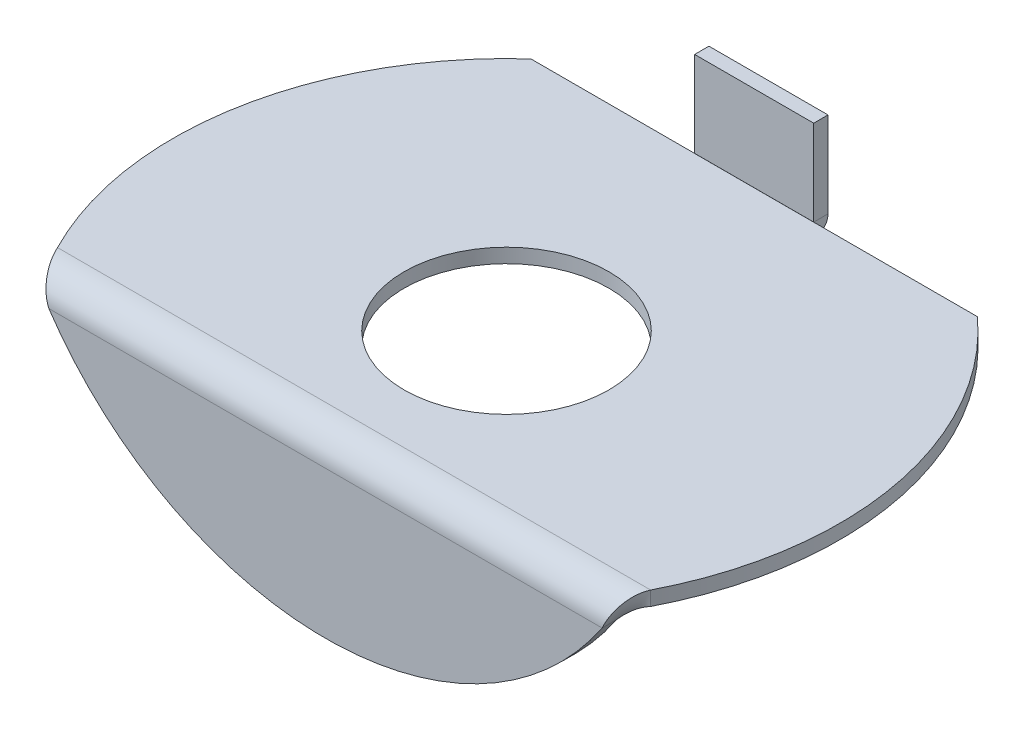
ISO-10303-21;
HEADER;
FILE_DESCRIPTION(('STEP AP214'),'2;1');
FILE_NAME('part.step','',(''),(''),'','','');
FILE_SCHEMA(('AUTOMOTIVE_DESIGN { 1 0 10303 214 1 1 1 1 }'));
ENDSEC;
DATA;
#1=APPLICATION_CONTEXT('core data for automotive mechanical design processes');
#2=APPLICATION_PROTOCOL_DEFINITION('international standard','automotive_design',2000,#1);
#3=PRODUCT_CONTEXT('',#1,'mechanical');
#4=PRODUCT('Part','Part','',(#3));
#5=PRODUCT_RELATED_PRODUCT_CATEGORY('part','',(#4));
#6=PRODUCT_DEFINITION_FORMATION('','',#4);
#7=PRODUCT_DEFINITION_CONTEXT('part definition',#1,'design');
#8=PRODUCT_DEFINITION('design','',#6,#7);
#9=PRODUCT_DEFINITION_SHAPE('','',#8);
#10=(LENGTH_UNIT() NAMED_UNIT(*) SI_UNIT(.MILLI.,.METRE.));
#11=(NAMED_UNIT(*) PLANE_ANGLE_UNIT() SI_UNIT($,.RADIAN.));
#12=(NAMED_UNIT(*) SI_UNIT($,.STERADIAN.) SOLID_ANGLE_UNIT());
#13=UNCERTAINTY_MEASURE_WITH_UNIT(LENGTH_MEASURE(1.E-05),#10,'distance_accuracy_value','');
#14=(GEOMETRIC_REPRESENTATION_CONTEXT(3) GLOBAL_UNCERTAINTY_ASSIGNED_CONTEXT((#13)) GLOBAL_UNIT_ASSIGNED_CONTEXT((#10,
#11,#12)) REPRESENTATION_CONTEXT('',''));
#15=CARTESIAN_POINT('',(0.,0.,0.));
#16=DIRECTION('',(0.,0.,1.));
#17=DIRECTION('',(1.,0.,0.));
#18=AXIS2_PLACEMENT_3D('',#15,#16,#17);
#19=CARTESIAN_POINT('',(0.,0.3,0.));
#20=DIRECTION('',(0.,-1.,0.));
#21=DIRECTION('',(0.,0.,-1.));
#22=AXIS2_PLACEMENT_3D('',#19,#20,#21);
#23=CYLINDRICAL_SURFACE('',#22,7.);
#24=CARTESIAN_POINT('',(0.,0.3,0.));
#25=DIRECTION('',(0.,1.,0.));
#26=DIRECTION('',(0.,0.,1.));
#27=AXIS2_PLACEMENT_3D('',#24,#25,#26);
#28=CIRCLE('',#27,7.);
#29=CARTESIAN_POINT('',(6.22575296650934,0.300000002239978,3.2));
#30=VERTEX_POINT('',#29);
#31=CARTESIAN_POINT('',(4.68614980554399,0.3,-5.2));
#32=VERTEX_POINT('',#31);
#33=EDGE_CURVE('E377',#30,#32,#28,.T.);
#34=ORIENTED_EDGE('',*,*,#33,.F.);
#35=CARTESIAN_POINT('',(6.22575296650934,2.23997762612699E-09,3.2));
#36=CARTESIAN_POINT('',(6.22575296650934,0.300000002239978,3.2));
#37=B_SPLINE_CURVE_WITH_KNOTS('',1,(#35,#36),.UNSPECIFIED.,.F.,.F.,(2,2),(0.,1.),.UNSPECIFIED.);
#38=CARTESIAN_POINT('',(6.22575296650935,0.,3.2));
#39=VERTEX_POINT('',#38);
#40=EDGE_CURVE('E12',#30,#39,#37,.F.);
#41=ORIENTED_EDGE('',*,*,#40,.T.);
#42=CARTESIAN_POINT('',(0.,0.,0.));
#43=DIRECTION('',(0.,1.,0.));
#44=DIRECTION('',(0.,0.,1.));
#45=AXIS2_PLACEMENT_3D('',#42,#43,#44);
#46=CIRCLE('',#45,7.);
#47=CARTESIAN_POINT('',(4.68614980554399,0.,-5.2));
#48=VERTEX_POINT('',#47);
#49=EDGE_CURVE('E360',#39,#48,#46,.T.);
#50=ORIENTED_EDGE('',*,*,#49,.T.);
#51=DIRECTION('',(0.,-1.,0.));
#52=VECTOR('',#51,1.);
#53=CARTESIAN_POINT('',(4.68614980554399,0.3,-5.2));
#54=LINE('',#53,#52);
#55=EDGE_CURVE('E386',#32,#48,#54,.T.);
#56=ORIENTED_EDGE('',*,*,#55,.F.);
#57=EDGE_LOOP('',(#34,#41,#50,#56));
#58=FACE_BOUND('',#57,.T.);
#59=ADVANCED_FACE('F61',(#58),#23,.T.);
#60=CARTESIAN_POINT('',(-4.68614980554399,0.,-5.2));
#61=VERTEX_POINT('',#60);
#62=CARTESIAN_POINT('',(-6.22575296650935,2.2399776803371E-09,3.2));
#63=VERTEX_POINT('',#62);
#64=EDGE_CURVE('E352',#61,#63,#46,.T.);
#65=ORIENTED_EDGE('',*,*,#64,.T.);
#66=CARTESIAN_POINT('',(-6.22575296650936,0.300000002239978,3.2));
#67=CARTESIAN_POINT('',(-6.22575296650936,2.23997762612699E-09,3.2));
#68=B_SPLINE_CURVE_WITH_KNOTS('',1,(#66,#67),.UNSPECIFIED.,.F.,.F.,(2,2),(0.,1.),.UNSPECIFIED.);
#69=CARTESIAN_POINT('',(-6.22575296650935,0.300000002239978,3.2));
#70=VERTEX_POINT('',#69);
#71=EDGE_CURVE('E383',#63,#70,#68,.F.);
#72=ORIENTED_EDGE('',*,*,#71,.T.);
#73=CARTESIAN_POINT('',(-4.68614980554399,0.3,-5.2));
#74=VERTEX_POINT('',#73);
#75=EDGE_CURVE('E382',#74,#70,#28,.T.);
#76=ORIENTED_EDGE('',*,*,#75,.F.);
#77=DIRECTION('',(0.,-1.,0.));
#78=VECTOR('',#77,1.);
#79=CARTESIAN_POINT('',(-4.68614980554399,0.3,-5.2));
#80=LINE('',#79,#78);
#81=EDGE_CURVE('E397',#74,#61,#80,.T.);
#82=ORIENTED_EDGE('',*,*,#81,.T.);
#83=EDGE_LOOP('',(#65,#72,#76,#82));
#84=FACE_BOUND('',#83,.T.);
#85=ADVANCED_FACE('F327',(#84),#23,.T.);
#86=CARTESIAN_POINT('',(0.,0.,0.));
#87=DIRECTION('',(0.,1.,0.));
#88=DIRECTION('',(0.,0.,1.));
#89=AXIS2_PLACEMENT_3D('',#86,#87,#88);
#90=PLANE('',#89);
#91=CARTESIAN_POINT('',(0.,0.,0.));
#92=DIRECTION('',(0.,-1.,0.));
#93=DIRECTION('',(0.,0.,-1.));
#94=AXIS2_PLACEMENT_3D('',#91,#92,#93);
#95=CIRCLE('',#94,2.15);
#96=CARTESIAN_POINT('',(0.,0.,-2.15));
#97=VERTEX_POINT('',#96);
#98=EDGE_CURVE('E291',#97,#97,#95,.T.);
#99=ORIENTED_EDGE('',*,*,#98,.F.);
#100=EDGE_LOOP('',(#99));
#101=FACE_BOUND('',#100,.T.);
#102=ORIENTED_EDGE('',*,*,#49,.F.);
#103=DIRECTION('',(-1.,0.,0.));
#104=VECTOR('',#103,1.);
#105=CARTESIAN_POINT('',(0.,0.,3.2));
#106=LINE('',#105,#104);
#107=EDGE_CURVE('E72',#39,#63,#106,.T.);
#108=ORIENTED_EDGE('',*,*,#107,.T.);
#109=ORIENTED_EDGE('',*,*,#64,.F.);
#110=DIRECTION('',(-1.,0.,0.));
#111=VECTOR('',#110,1.);
#112=CARTESIAN_POINT('',(-4.68614980554399,0.,-5.2));
#113=LINE('',#112,#111);
#114=CARTESIAN_POINT('',(-1.25,0.,-5.2));
#115=VERTEX_POINT('',#114);
#116=EDGE_CURVE('E359',#115,#61,#113,.T.);
#117=ORIENTED_EDGE('',*,*,#116,.F.);
#118=DIRECTION('',(-2.16840434497072E-13,0.,-1.));
#119=VECTOR('',#118,1.);
#120=CARTESIAN_POINT('',(-1.24999999999887,0.,2.71050543121096E-13));
#121=LINE('',#120,#119);
#122=CARTESIAN_POINT('',(-1.25,0.,-5.199));
#123=VERTEX_POINT('',#122);
#124=EDGE_CURVE('E384',#123,#115,#121,.T.);
#125=ORIENTED_EDGE('',*,*,#124,.F.);
#126=DIRECTION('',(-1.,0.,0.));
#127=VECTOR('',#126,1.);
#128=CARTESIAN_POINT('',(-1.25,0.,-5.199));
#129=LINE('',#128,#127);
#130=CARTESIAN_POINT('',(1.25,0.,-5.199));
#131=VERTEX_POINT('',#130);
#132=EDGE_CURVE('E433',#123,#131,#129,.F.);
#133=ORIENTED_EDGE('',*,*,#132,.T.);
#134=CARTESIAN_POINT('',(1.25,0.301,-5.199));
#135=DIRECTION('',(-1.,0.,0.));
#136=DIRECTION('',(0.,0.,1.));
#137=AXIS2_PLACEMENT_3D('',#134,#135,#136);
#138=CIRCLE('',#137,0.301);
#139=CARTESIAN_POINT('',(1.25,0.,-5.2));
#140=VERTEX_POINT('',#139);
#141=EDGE_CURVE('E429',#131,#140,#138,.F.);
#142=ORIENTED_EDGE('',*,*,#141,.T.);
#143=EDGE_CURVE('E391',#48,#140,#113,.T.);
#144=ORIENTED_EDGE('',*,*,#143,.F.);
#145=EDGE_LOOP('',(#102,#108,#109,#117,#125,#133,#142,#144));
#146=FACE_BOUND('',#145,.T.);
#147=ADVANCED_FACE('F63',(#101,#146),#90,.F.);
#148=CARTESIAN_POINT('',(-4.68614980554399,0.3,-5.2));
#149=DIRECTION('',(0.,0.,1.));
#150=DIRECTION('',(1.,0.,0.));
#151=AXIS2_PLACEMENT_3D('',#148,#149,#150);
#152=PLANE('',#151);
#153=DIRECTION('',(0.,-1.,0.));
#154=VECTOR('',#153,1.);
#155=CARTESIAN_POINT('',(-1.25,0.3,-5.2));
#156=LINE('',#155,#154);
#157=CARTESIAN_POINT('',(-1.25,0.3,-5.2));
#158=VERTEX_POINT('',#157);
#159=EDGE_CURVE('E405',#158,#115,#156,.T.);
#160=ORIENTED_EDGE('',*,*,#159,.T.);
#161=ORIENTED_EDGE('',*,*,#116,.T.);
#162=ORIENTED_EDGE('',*,*,#81,.F.);
#163=DIRECTION('',(-1.,0.,0.));
#164=VECTOR('',#163,1.);
#165=CARTESIAN_POINT('',(-4.68614980554399,0.3,-5.2));
#166=LINE('',#165,#164);
#167=EDGE_CURVE('E392',#158,#74,#166,.T.);
#168=ORIENTED_EDGE('',*,*,#167,.F.);
#169=EDGE_LOOP('',(#160,#161,#162,#168));
#170=FACE_BOUND('',#169,.T.);
#171=ADVANCED_FACE('F497',(#170),#152,.F.);
#172=DIRECTION('',(0.,-1.,0.));
#173=VECTOR('',#172,1.);
#174=CARTESIAN_POINT('',(1.25,0.3,-5.2));
#175=LINE('',#174,#173);
#176=CARTESIAN_POINT('',(1.25,0.3,-5.2));
#177=VERTEX_POINT('',#176);
#178=EDGE_CURVE('E365',#177,#140,#175,.T.);
#179=ORIENTED_EDGE('',*,*,#178,.F.);
#180=EDGE_CURVE('E393',#32,#177,#166,.T.);
#181=ORIENTED_EDGE('',*,*,#180,.F.);
#182=ORIENTED_EDGE('',*,*,#55,.T.);
#183=ORIENTED_EDGE('',*,*,#143,.T.);
#184=EDGE_LOOP('',(#179,#181,#182,#183));
#185=FACE_BOUND('',#184,.T.);
#186=ADVANCED_FACE('F415',(#185),#152,.F.);
#187=CARTESIAN_POINT('',(0.,0.3,0.));
#188=DIRECTION('',(0.,1.,0.));
#189=DIRECTION('',(0.,0.,1.));
#190=AXIS2_PLACEMENT_3D('',#187,#188,#189);
#191=PLANE('',#190);
#192=CARTESIAN_POINT('',(0.,0.3,0.));
#193=DIRECTION('',(0.,1.,0.));
#194=DIRECTION('',(0.,0.,1.));
#195=AXIS2_PLACEMENT_3D('',#192,#193,#194);
#196=CIRCLE('',#195,2.15);
#197=CARTESIAN_POINT('',(0.,0.3,2.15));
#198=VERTEX_POINT('',#197);
#199=EDGE_CURVE('E505',#198,#198,#196,.F.);
#200=ORIENTED_EDGE('',*,*,#199,.T.);
#201=EDGE_LOOP('',(#200));
#202=FACE_BOUND('',#201,.T.);
#203=DIRECTION('',(-1.,0.,0.));
#204=VECTOR('',#203,1.);
#205=CARTESIAN_POINT('',(0.,0.3,3.2));
#206=LINE('',#205,#204);
#207=EDGE_CURVE('E203',#30,#70,#206,.T.);
#208=ORIENTED_EDGE('',*,*,#207,.F.);
#209=ORIENTED_EDGE('',*,*,#33,.T.);
#210=ORIENTED_EDGE('',*,*,#180,.T.);
#211=DIRECTION('',(0.,2.7105054312134E-13,-1.));
#212=VECTOR('',#211,1.);
#213=CARTESIAN_POINT('',(1.25,0.3,-5.199));
#214=LINE('',#213,#212);
#215=CARTESIAN_POINT('',(1.25,0.3,-5.199));
#216=VERTEX_POINT('',#215);
#217=EDGE_CURVE('E424',#216,#177,#214,.T.);
#218=ORIENTED_EDGE('',*,*,#217,.F.);
#219=DIRECTION('',(-1.,0.,0.));
#220=VECTOR('',#219,1.);
#221=CARTESIAN_POINT('',(-1.25,0.3,-5.199));
#222=LINE('',#221,#220);
#223=CARTESIAN_POINT('',(-1.25,0.3,-5.199));
#224=VERTEX_POINT('',#223);
#225=EDGE_CURVE('E88',#224,#216,#222,.F.);
#226=ORIENTED_EDGE('',*,*,#225,.F.);
#227=DIRECTION('',(2.16840434497072E-13,-2.7105054312134E-13,1.));
#228=VECTOR('',#227,1.);
#229=CARTESIAN_POINT('',(-1.25,0.3,-5.2));
#230=LINE('',#229,#228);
#231=EDGE_CURVE('E373',#158,#224,#230,.T.);
#232=ORIENTED_EDGE('',*,*,#231,.F.);
#233=ORIENTED_EDGE('',*,*,#167,.T.);
#234=ORIENTED_EDGE('',*,*,#75,.T.);
#235=EDGE_LOOP('',(#208,#209,#210,#218,#226,#232,#233,#234));
#236=FACE_BOUND('',#235,.T.);
#237=ADVANCED_FACE('F337',(#202,#236),#191,.T.);
#238=CARTESIAN_POINT('',(-1.25,0.301,-5.199));
#239=DIRECTION('',(1.,0.,0.));
#240=DIRECTION('',(0.,0.,-1.));
#241=AXIS2_PLACEMENT_3D('',#238,#239,#240);
#242=PLANE('',#241);
#243=ORIENTED_EDGE('',*,*,#159,.F.);
#244=ORIENTED_EDGE('',*,*,#231,.T.);
#245=CARTESIAN_POINT('',(-1.25,0.301,-5.199));
#246=DIRECTION('',(-1.,0.,0.));
#247=DIRECTION('',(0.,0.,1.));
#248=AXIS2_PLACEMENT_3D('',#245,#246,#247);
#249=CIRCLE('',#248,0.00100000000000013);
#250=CARTESIAN_POINT('',(-1.25,0.301,-5.2));
#251=VERTEX_POINT('',#250);
#252=EDGE_CURVE('E445',#251,#224,#249,.T.);
#253=ORIENTED_EDGE('',*,*,#252,.F.);
#254=DIRECTION('',(0.,0.,-1.));
#255=VECTOR('',#254,1.);
#256=CARTESIAN_POINT('',(-1.25,0.301,-5.2));
#257=LINE('',#256,#255);
#258=CARTESIAN_POINT('',(-1.25,0.301000000000002,-5.5));
#259=VERTEX_POINT('',#258);
#260=EDGE_CURVE('E473',#251,#259,#257,.T.);
#261=ORIENTED_EDGE('',*,*,#260,.T.);
#262=CARTESIAN_POINT('',(-1.25,0.301,-5.199));
#263=DIRECTION('',(-1.,0.,0.));
#264=DIRECTION('',(0.,0.,1.));
#265=AXIS2_PLACEMENT_3D('',#262,#263,#264);
#266=CIRCLE('',#265,0.301);
#267=EDGE_CURVE('E436',#259,#115,#266,.T.);
#268=ORIENTED_EDGE('',*,*,#267,.T.);
#269=EDGE_LOOP('',(#243,#244,#253,#261,#268));
#270=FACE_BOUND('',#269,.T.);
#271=ADVANCED_FACE('F517',(#270),#242,.F.);
#272=CARTESIAN_POINT('',(1.25,0.301,-5.199));
#273=DIRECTION('',(1.,0.,0.));
#274=DIRECTION('',(0.,0.,-1.));
#275=AXIS2_PLACEMENT_3D('',#272,#273,#274);
#276=PLANE('',#275);
#277=ORIENTED_EDGE('',*,*,#217,.T.);
#278=ORIENTED_EDGE('',*,*,#178,.T.);
#279=CARTESIAN_POINT('',(1.25,0.301,-5.5));
#280=VERTEX_POINT('',#279);
#281=EDGE_CURVE('E421',#140,#280,#138,.F.);
#282=ORIENTED_EDGE('',*,*,#281,.T.);
#283=DIRECTION('',(0.,0.,-1.));
#284=VECTOR('',#283,1.);
#285=CARTESIAN_POINT('',(1.25,0.301,-5.2));
#286=LINE('',#285,#284);
#287=CARTESIAN_POINT('',(1.25,0.301,-5.2));
#288=VERTEX_POINT('',#287);
#289=EDGE_CURVE('E205',#288,#280,#286,.T.);
#290=ORIENTED_EDGE('',*,*,#289,.F.);
#291=CARTESIAN_POINT('',(1.25,0.301,-5.199));
#292=DIRECTION('',(-1.,0.,0.));
#293=DIRECTION('',(0.,0.,1.));
#294=AXIS2_PLACEMENT_3D('',#291,#292,#293);
#295=CIRCLE('',#294,0.00100000000000013);
#296=EDGE_CURVE('E450',#216,#288,#295,.F.);
#297=ORIENTED_EDGE('',*,*,#296,.F.);
#298=EDGE_LOOP('',(#277,#278,#282,#290,#297));
#299=FACE_BOUND('',#298,.T.);
#300=ADVANCED_FACE('F420',(#299),#276,.T.);
#301=CARTESIAN_POINT('',(-1.25,0.301,-5.199));
#302=DIRECTION('',(-1.,0.,0.));
#303=DIRECTION('',(0.,0.,-1.));
#304=AXIS2_PLACEMENT_3D('',#301,#302,#303);
#305=CYLINDRICAL_SURFACE('',#304,0.301);
#306=ORIENTED_EDGE('',*,*,#132,.F.);
#307=ORIENTED_EDGE('',*,*,#124,.T.);
#308=ORIENTED_EDGE('',*,*,#267,.F.);
#309=DIRECTION('',(1.,0.,0.));
#310=VECTOR('',#309,1.);
#311=CARTESIAN_POINT('',(-1.25,0.301000000000002,-5.5));
#312=LINE('',#311,#310);
#313=EDGE_CURVE('E431',#259,#280,#312,.T.);
#314=ORIENTED_EDGE('',*,*,#313,.T.);
#315=ORIENTED_EDGE('',*,*,#281,.F.);
#316=ORIENTED_EDGE('',*,*,#141,.F.);
#317=EDGE_LOOP('',(#306,#307,#308,#314,#315,#316));
#318=FACE_BOUND('',#317,.T.);
#319=ADVANCED_FACE('F428',(#318),#305,.T.);
#320=CARTESIAN_POINT('',(-1.25,0.301,-5.199));
#321=DIRECTION('',(-1.,0.,0.));
#322=DIRECTION('',(0.,0.,-1.));
#323=AXIS2_PLACEMENT_3D('',#320,#321,#322);
#324=CYLINDRICAL_SURFACE('',#323,0.00100000000000013);
#325=ORIENTED_EDGE('',*,*,#225,.T.);
#326=ORIENTED_EDGE('',*,*,#296,.T.);
#327=DIRECTION('',(-1.,0.,0.));
#328=VECTOR('',#327,1.);
#329=CARTESIAN_POINT('',(1.25,0.301,-5.2));
#330=LINE('',#329,#328);
#331=EDGE_CURVE('E475',#288,#251,#330,.T.);
#332=ORIENTED_EDGE('',*,*,#331,.T.);
#333=ORIENTED_EDGE('',*,*,#252,.T.);
#334=EDGE_LOOP('',(#325,#326,#332,#333));
#335=FACE_BOUND('',#334,.T.);
#336=ADVANCED_FACE('F531',(#335),#324,.F.);
#337=CARTESIAN_POINT('',(-1.25,2.1,-5.50000000000001));
#338=DIRECTION('',(1.,0.,0.));
#339=DIRECTION('',(0.,0.,-1.));
#340=AXIS2_PLACEMENT_3D('',#337,#338,#339);
#341=PLANE('',#340);
#342=ORIENTED_EDGE('',*,*,#260,.F.);
#343=DIRECTION('',(0.,1.,0.));
#344=VECTOR('',#343,1.);
#345=CARTESIAN_POINT('',(-1.25,2.1,-5.20000000000001));
#346=LINE('',#345,#344);
#347=CARTESIAN_POINT('',(-1.25,2.1,-5.20000000000001));
#348=VERTEX_POINT('',#347);
#349=EDGE_CURVE('E470',#251,#348,#346,.T.);
#350=ORIENTED_EDGE('',*,*,#349,.T.);
#351=DIRECTION('',(0.,0.,1.));
#352=VECTOR('',#351,1.);
#353=CARTESIAN_POINT('',(-1.25,2.1,-5.50000000000001));
#354=LINE('',#353,#352);
#355=CARTESIAN_POINT('',(-1.25,2.1,-5.50000000000001));
#356=VERTEX_POINT('',#355);
#357=EDGE_CURVE('E448',#356,#348,#354,.T.);
#358=ORIENTED_EDGE('',*,*,#357,.F.);
#359=DIRECTION('',(0.,1.,0.));
#360=VECTOR('',#359,1.);
#361=CARTESIAN_POINT('',(-1.25,2.1,-5.50000000000001));
#362=LINE('',#361,#360);
#363=EDGE_CURVE('E463',#259,#356,#362,.T.);
#364=ORIENTED_EDGE('',*,*,#363,.F.);
#365=EDGE_LOOP('',(#342,#350,#358,#364));
#366=FACE_BOUND('',#365,.T.);
#367=ADVANCED_FACE('F534',(#366),#341,.F.);
#368=CARTESIAN_POINT('',(1.25,0.299999999999999,-5.5));
#369=DIRECTION('',(-1.,0.,0.));
#370=DIRECTION('',(0.,0.,1.));
#371=AXIS2_PLACEMENT_3D('',#368,#369,#370);
#372=PLANE('',#371);
#373=ORIENTED_EDGE('',*,*,#289,.T.);
#374=DIRECTION('',(0.,-1.,0.));
#375=VECTOR('',#374,1.);
#376=CARTESIAN_POINT('',(1.25,0.299999999999999,-5.5));
#377=LINE('',#376,#375);
#378=CARTESIAN_POINT('',(1.25,2.1,-5.50000000000001));
#379=VERTEX_POINT('',#378);
#380=EDGE_CURVE('E458',#379,#280,#377,.T.);
#381=ORIENTED_EDGE('',*,*,#380,.F.);
#382=DIRECTION('',(0.,0.,1.));
#383=VECTOR('',#382,1.);
#384=CARTESIAN_POINT('',(1.25,2.1,-5.50000000000001));
#385=LINE('',#384,#383);
#386=CARTESIAN_POINT('',(1.25,2.1,-5.20000000000001));
#387=VERTEX_POINT('',#386);
#388=EDGE_CURVE('E455',#379,#387,#385,.T.);
#389=ORIENTED_EDGE('',*,*,#388,.T.);
#390=DIRECTION('',(0.,-1.,0.));
#391=VECTOR('',#390,1.);
#392=CARTESIAN_POINT('',(1.25,0.3,-5.2));
#393=LINE('',#392,#391);
#394=EDGE_CURVE('E465',#387,#288,#393,.T.);
#395=ORIENTED_EDGE('',*,*,#394,.T.);
#396=EDGE_LOOP('',(#373,#381,#389,#395));
#397=FACE_BOUND('',#396,.T.);
#398=ADVANCED_FACE('F538',(#397),#372,.F.);
#399=CARTESIAN_POINT('',(-1.25,0.3,-5.5));
#400=DIRECTION('',(0.,0.,1.));
#401=DIRECTION('',(0.,-1.,0.));
#402=AXIS2_PLACEMENT_3D('',#399,#400,#401);
#403=PLANE('',#402);
#404=ORIENTED_EDGE('',*,*,#313,.F.);
#405=ORIENTED_EDGE('',*,*,#363,.T.);
#406=DIRECTION('',(1.,0.,0.));
#407=VECTOR('',#406,1.);
#408=CARTESIAN_POINT('',(1.25,2.1,-5.50000000000001));
#409=LINE('',#408,#407);
#410=EDGE_CURVE('E461',#356,#379,#409,.T.);
#411=ORIENTED_EDGE('',*,*,#410,.T.);
#412=ORIENTED_EDGE('',*,*,#380,.T.);
#413=EDGE_LOOP('',(#404,#405,#411,#412));
#414=FACE_BOUND('',#413,.T.);
#415=ADVANCED_FACE('F545',(#414),#403,.F.);
#416=CARTESIAN_POINT('',(-1.25,0.300000000000001,-5.2));
#417=DIRECTION('',(0.,0.,1.));
#418=DIRECTION('',(0.,-1.,0.));
#419=AXIS2_PLACEMENT_3D('',#416,#417,#418);
#420=PLANE('',#419);
#421=ORIENTED_EDGE('',*,*,#349,.F.);
#422=ORIENTED_EDGE('',*,*,#331,.F.);
#423=ORIENTED_EDGE('',*,*,#394,.F.);
#424=DIRECTION('',(1.,0.,0.));
#425=VECTOR('',#424,1.);
#426=CARTESIAN_POINT('',(1.25,2.1,-5.20000000000001));
#427=LINE('',#426,#425);
#428=EDGE_CURVE('E468',#348,#387,#427,.T.);
#429=ORIENTED_EDGE('',*,*,#428,.F.);
#430=EDGE_LOOP('',(#421,#422,#423,#429));
#431=FACE_BOUND('',#430,.T.);
#432=ADVANCED_FACE('F541',(#431),#420,.T.);
#433=CARTESIAN_POINT('',(1.25,2.1,-5.50000000000001));
#434=DIRECTION('',(0.,-1.,0.));
#435=DIRECTION('',(0.,0.,-1.));
#436=AXIS2_PLACEMENT_3D('',#433,#434,#435);
#437=PLANE('',#436);
#438=ORIENTED_EDGE('',*,*,#428,.T.);
#439=ORIENTED_EDGE('',*,*,#388,.F.);
#440=ORIENTED_EDGE('',*,*,#410,.F.);
#441=ORIENTED_EDGE('',*,*,#357,.T.);
#442=EDGE_LOOP('',(#438,#439,#440,#441));
#443=FACE_BOUND('',#442,.T.);
#444=ADVANCED_FACE('F258',(#443),#437,.F.);
#445=CARTESIAN_POINT('',(5.80830938019191,-0.300000000000002,3.80000000223998));
#446=CARTESIAN_POINT('',(5.84310158907512,-0.221448345246882,3.80000000223998));
#447=CARTESIAN_POINT('',(5.87788331124482,-0.142951268798124,3.78438360818267));
#448=CARTESIAN_POINT('',(5.94745724229772,0.00217138935063355,3.72427183496982));
#449=CARTESIAN_POINT('',(5.98224420782418,0.0687280333615189,3.67980010723015));
#450=CARTESIAN_POINT('',(6.05181813887708,0.179800107230143,3.56872803336152));
#451=CARTESIAN_POINT('',(6.08660510440353,0.224271834969817,3.50217138935064));
#452=CARTESIAN_POINT('',(6.15617903545643,0.284383608182666,3.35704873120188));
#453=CARTESIAN_POINT('',(6.19096075762613,0.300000002239978,3.27855165475312));
#454=CARTESIAN_POINT('',(6.22575296650934,0.300000002239978,3.2));
#455=CARTESIAN_POINT('',(5.80830938019191,-0.300000000000001,3.50000000223998));
#456=CARTESIAN_POINT('',(5.8430998599974,-0.260726124378125,3.50000000223998));
#457=CARTESIAN_POINT('',(5.87788331124482,-0.221475634105908,3.49219180518217));
#458=CARTESIAN_POINT('',(5.94745724229772,-0.148914304760635,3.46213591846354));
#459=CARTESIAN_POINT('',(5.98224420782417,-0.115635982630955,3.43990005451069));
#460=CARTESIAN_POINT('',(6.05181813887708,-0.0600999454893101,3.38436401736905));
#461=CARTESIAN_POINT('',(6.08660510440353,-0.0378640815364609,3.35108569523937));
#462=CARTESIAN_POINT('',(6.15617903545643,-0.00780819481782804,3.27852436589409));
#463=CARTESIAN_POINT('',(6.19096248670385,2.23997745369988E-09,3.23927387562188));
#464=CARTESIAN_POINT('',(6.22575296650934,2.23997762612699E-09,3.2));
#465=B_SPLINE_SURFACE_WITH_KNOTS('',1,3,((#445,#446,#447,#448,#449,#450,#451,#452,#453,#454),
(#455,#456,#457,#458,#459,#460,#461,#462,#463,#464)),.UNSPECIFIED.,.F.,.F.,.F.,(2,2),(4,2,2,2,
4),(0.,1.),(0.,0.25,0.5,0.75,1.),.UNSPECIFIED.);
#466=CARTESIAN_POINT('',(5.80830938019191,-0.300000000000002,3.80000000223998));
#467=CARTESIAN_POINT('',(5.80830938019191,-0.300000000000001,3.50000000223998));
#468=B_SPLINE_CURVE_WITH_KNOTS('',1,(#466,#467),.UNSPECIFIED.,.F.,.F.,(2,2),(0.,1.),.UNSPECIFIED.);
#469=CARTESIAN_POINT('',(5.80830938019192,-0.300000000000002,3.80000000223998));
#470=VERTEX_POINT('',#469);
#471=CARTESIAN_POINT('',(5.80830938019193,-0.300000000000001,3.5));
#472=VERTEX_POINT('',#471);
#473=EDGE_CURVE('E184',#470,#472,#468,.T.);
#474=CARTESIAN_POINT('',(5.80830938019191,-0.300000000000001,3.50000000223998));
#475=CARTESIAN_POINT('',(5.8430998599974,-0.260726124378125,3.50000000223998));
#476=CARTESIAN_POINT('',(5.87788331124482,-0.221475634105908,3.49219180518217));
#477=CARTESIAN_POINT('',(5.94745724229772,-0.148914304760635,3.46213591846354));
#478=CARTESIAN_POINT('',(5.98224420782417,-0.115635982630955,3.43990005451069));
#479=CARTESIAN_POINT('',(6.05181813887708,-0.0600999454893101,3.38436401736905));
#480=CARTESIAN_POINT('',(6.08660510440353,-0.0378640815364609,3.35108569523937));
#481=CARTESIAN_POINT('',(6.15617903545643,-0.00780819481782804,3.27852436589409));
#482=CARTESIAN_POINT('',(6.19096248670385,2.23997745369988E-09,3.23927387562188));
#483=CARTESIAN_POINT('',(6.22575296650934,2.23997762612699E-09,3.2));
#484=B_SPLINE_CURVE_WITH_KNOTS('',3,(#474,#475,#476,#477,#478,#479,#480,#481,#482,#483),
.UNSPECIFIED.,.F.,.F.,(4,2,2,2,4),(0.,0.25,0.5,0.75,1.),.UNSPECIFIED.);
#485=EDGE_CURVE('E79',#472,#39,#484,.T.);
#486=CARTESIAN_POINT('',(6.22575296650934,0.300000002239978,3.2));
#487=CARTESIAN_POINT('',(6.19096075762613,0.300000002239978,3.27855165475312));
#488=CARTESIAN_POINT('',(6.15617903545643,0.284383608182666,3.35704873120188));
#489=CARTESIAN_POINT('',(6.08660510440353,0.224271834969817,3.50217138935064));
#490=CARTESIAN_POINT('',(6.05181813887708,0.179800107230143,3.56872803336152));
#491=CARTESIAN_POINT('',(5.98224420782418,0.0687280333615189,3.67980010723015));
#492=CARTESIAN_POINT('',(5.94745724229772,0.00217138935063355,3.72427183496982));
#493=CARTESIAN_POINT('',(5.87788331124482,-0.142951268798124,3.78438360818267));
#494=CARTESIAN_POINT('',(5.84310158907512,-0.221448345246882,3.80000000223998));
#495=CARTESIAN_POINT('',(5.80830938019191,-0.300000000000002,3.80000000223998));
#496=B_SPLINE_CURVE_WITH_KNOTS('',3,(#486,#487,#488,#489,#490,#491,#492,#493,#494,#495),
.UNSPECIFIED.,.F.,.F.,(4,2,2,2,4),(0.,0.25,0.5,0.75,1.),.UNSPECIFIED.);
#497=EDGE_CURVE('E206',#470,#30,#496,.F.);
#498=ORIENTED_EDGE('',*,*,#473,.T.);
#499=ORIENTED_EDGE('',*,*,#485,.T.);
#500=ORIENTED_EDGE('',*,*,#40,.F.);
#501=ORIENTED_EDGE('',*,*,#497,.F.);
#502=EDGE_LOOP('',(#498,#499,#500,#501));
#503=FACE_BOUND('',#502,.T.);
#504=ADVANCED_FACE('F247',(#503),#465,.T.);
#505=CARTESIAN_POINT('',(-6.22575296650936,0.300000002239978,3.2));
#506=CARTESIAN_POINT('',(-6.19096075762615,0.300000002239978,3.27855165475312));
#507=CARTESIAN_POINT('',(-6.15617903545645,0.284383608182667,3.35704873120188));
#508=CARTESIAN_POINT('',(-6.08660510440355,0.224271834969817,3.50217138935063));
#509=CARTESIAN_POINT('',(-6.0518181388771,0.179800107230145,3.56872803336152));
#510=CARTESIAN_POINT('',(-5.98224420782419,0.0687280333615201,3.67980010723014));
#511=CARTESIAN_POINT('',(-5.94745724229774,0.00217138935063478,3.72427183496982));
#512=CARTESIAN_POINT('',(-5.87788331124484,-0.142951268798123,3.78438360818267));
#513=CARTESIAN_POINT('',(-5.84310158907514,-0.22144834524688,3.80000000223998));
#514=CARTESIAN_POINT('',(-5.80830938019193,-0.300000000000001,3.80000000223998));
#515=CARTESIAN_POINT('',(-6.22575296650936,2.23997762612699E-09,3.2));
#516=CARTESIAN_POINT('',(-6.19096248670387,2.23997784228757E-09,3.23927387562188));
#517=CARTESIAN_POINT('',(-6.15617903545645,-0.00780819481782809,3.27852436589409));
#518=CARTESIAN_POINT('',(-6.08660510440355,-0.0378640815364603,3.35108569523937));
#519=CARTESIAN_POINT('',(-6.0518181388771,-0.0600999454893098,3.38436401736905));
#520=CARTESIAN_POINT('',(-5.98224420782419,-0.115635982630954,3.43990005451069));
#521=CARTESIAN_POINT('',(-5.94745724229774,-0.148914304760635,3.46213591846354));
#522=CARTESIAN_POINT('',(-5.87788331124484,-0.221475634105907,3.49219180518217));
#523=CARTESIAN_POINT('',(-5.84309985999743,-0.260726124378121,3.50000000223998));
#524=CARTESIAN_POINT('',(-5.80830938019193,-0.300000000000001,3.50000000223998));
#525=B_SPLINE_SURFACE_WITH_KNOTS('',1,3,((#505,#506,#507,#508,#509,#510,#511,#512,#513,#514),
(#515,#516,#517,#518,#519,#520,#521,#522,#523,#524)),.UNSPECIFIED.,.F.,.F.,.F.,(2,2),(4,2,2,2,
4),(0.,1.),(0.,0.25,0.5,0.75,1.),.UNSPECIFIED.);
#526=CARTESIAN_POINT('',(-6.22575296650936,2.23997762612699E-09,3.2));
#527=CARTESIAN_POINT('',(-6.19096248670387,2.23997784228757E-09,3.23927387562188));
#528=CARTESIAN_POINT('',(-6.15617903545645,-0.00780819481782809,3.27852436589409));
#529=CARTESIAN_POINT('',(-6.08660510440355,-0.0378640815364603,3.35108569523937));
#530=CARTESIAN_POINT('',(-6.0518181388771,-0.0600999454893098,3.38436401736905));
#531=CARTESIAN_POINT('',(-5.98224420782419,-0.115635982630954,3.43990005451069));
#532=CARTESIAN_POINT('',(-5.94745724229774,-0.148914304760635,3.46213591846354));
#533=CARTESIAN_POINT('',(-5.87788331124484,-0.221475634105907,3.49219180518217));
#534=CARTESIAN_POINT('',(-5.84309985999743,-0.260726124378121,3.50000000223998));
#535=CARTESIAN_POINT('',(-5.80830938019193,-0.300000000000001,3.50000000223998));
#536=B_SPLINE_CURVE_WITH_KNOTS('',3,(#526,#527,#528,#529,#530,#531,#532,#533,#534,#535),
.UNSPECIFIED.,.F.,.F.,(4,2,2,2,4),(0.,0.25,0.5,0.75,1.),.UNSPECIFIED.);
#537=CARTESIAN_POINT('',(-5.80830938019193,-0.300000000000001,3.5));
#538=VERTEX_POINT('',#537);
#539=EDGE_CURVE('E195',#63,#538,#536,.T.);
#540=CARTESIAN_POINT('',(-5.80830938019193,-0.300000000000001,3.50000000223998));
#541=CARTESIAN_POINT('',(-5.80830938019193,-0.300000000000001,3.80000000223998));
#542=B_SPLINE_CURVE_WITH_KNOTS('',1,(#540,#541),.UNSPECIFIED.,.F.,.F.,(2,2),(0.,1.),.UNSPECIFIED.);
#543=CARTESIAN_POINT('',(-5.80830938019193,-0.300000000000002,3.8));
#544=VERTEX_POINT('',#543);
#545=EDGE_CURVE('E181',#538,#544,#542,.T.);
#546=CARTESIAN_POINT('',(-5.80830938019193,-0.300000000000001,3.80000000223998));
#547=CARTESIAN_POINT('',(-5.84310158907514,-0.22144834524688,3.80000000223998));
#548=CARTESIAN_POINT('',(-5.87788331124484,-0.142951268798123,3.78438360818267));
#549=CARTESIAN_POINT('',(-5.94745724229774,0.00217138935063478,3.72427183496982));
#550=CARTESIAN_POINT('',(-5.98224420782419,0.0687280333615201,3.67980010723014));
#551=CARTESIAN_POINT('',(-6.0518181388771,0.179800107230145,3.56872803336152));
#552=CARTESIAN_POINT('',(-6.08660510440355,0.224271834969817,3.50217138935063));
#553=CARTESIAN_POINT('',(-6.15617903545645,0.284383608182667,3.35704873120188));
#554=CARTESIAN_POINT('',(-6.19096075762615,0.300000002239978,3.27855165475312));
#555=CARTESIAN_POINT('',(-6.22575296650936,0.300000002239978,3.2));
#556=B_SPLINE_CURVE_WITH_KNOTS('',3,(#546,#547,#548,#549,#550,#551,#552,#553,#554,#555),
.UNSPECIFIED.,.F.,.F.,(4,2,2,2,4),(0.,0.25,0.5,0.75,1.),.UNSPECIFIED.);
#557=EDGE_CURVE('E191',#70,#544,#556,.F.);
#558=ORIENTED_EDGE('',*,*,#539,.T.);
#559=ORIENTED_EDGE('',*,*,#545,.T.);
#560=ORIENTED_EDGE('',*,*,#557,.F.);
#561=ORIENTED_EDGE('',*,*,#71,.F.);
#562=EDGE_LOOP('',(#558,#559,#560,#561));
#563=FACE_BOUND('',#562,.T.);
#564=ADVANCED_FACE('F190',(#563),#525,.T.);
#565=CARTESIAN_POINT('',(-12.4751612704127,-0.3,3.2));
#566=DIRECTION('',(1.,0.,0.));
#567=DIRECTION('',(0.,0.,-1.));
#568=AXIS2_PLACEMENT_3D('',#565,#566,#567);
#569=CYLINDRICAL_SURFACE('',#568,0.600000002239978);
#570=ORIENTED_EDGE('',*,*,#207,.T.);
#571=ORIENTED_EDGE('',*,*,#557,.T.);
#572=DIRECTION('',(-1.,0.,0.));
#573=VECTOR('',#572,1.);
#574=CARTESIAN_POINT('',(0.,-0.300000000000002,3.8));
#575=LINE('',#574,#573);
#576=EDGE_CURVE('E167',#470,#544,#575,.T.);
#577=ORIENTED_EDGE('',*,*,#576,.F.);
#578=ORIENTED_EDGE('',*,*,#497,.T.);
#579=EDGE_LOOP('',(#570,#571,#577,#578));
#580=FACE_BOUND('',#579,.T.);
#581=ADVANCED_FACE('F201',(#580),#569,.T.);
#582=CARTESIAN_POINT('',(-12.4751612704127,-0.3,3.2));
#583=DIRECTION('',(1.,0.,0.));
#584=DIRECTION('',(0.,0.,-1.));
#585=AXIS2_PLACEMENT_3D('',#582,#583,#584);
#586=CYLINDRICAL_SURFACE('',#585,0.300000002239978);
#587=ORIENTED_EDGE('',*,*,#107,.F.);
#588=ORIENTED_EDGE('',*,*,#485,.F.);
#589=DIRECTION('',(-1.,0.,0.));
#590=VECTOR('',#589,1.);
#591=CARTESIAN_POINT('',(0.,-0.300000000000001,3.5));
#592=LINE('',#591,#590);
#593=EDGE_CURVE('E197',#472,#538,#592,.T.);
#594=ORIENTED_EDGE('',*,*,#593,.T.);
#595=ORIENTED_EDGE('',*,*,#539,.F.);
#596=EDGE_LOOP('',(#587,#588,#594,#595));
#597=FACE_BOUND('',#596,.T.);
#598=ADVANCED_FACE('F220',(#597),#586,.F.);
#599=CARTESIAN_POINT('',(0.,3.6068583470577,3.80000000000001));
#600=DIRECTION('',(0.,0.,1.));
#601=DIRECTION('',(0.,-1.,0.));
#602=AXIS2_PLACEMENT_3D('',#599,#600,#601);
#603=PLANE('',#602);
#604=CARTESIAN_POINT('',(0.,3.6068583470577,3.80000000000001));
#605=DIRECTION('',(0.,0.,1.));
#606=DIRECTION('',(0.,-1.,0.));
#607=AXIS2_PLACEMENT_3D('',#604,#605,#606);
#608=CIRCLE('',#607,7.);
#609=EDGE_CURVE('E170',#544,#470,#608,.T.);
#610=ORIENTED_EDGE('',*,*,#609,.T.);
#611=ORIENTED_EDGE('',*,*,#576,.T.);
#612=EDGE_LOOP('',(#610,#611));
#613=FACE_BOUND('',#612,.T.);
#614=ADVANCED_FACE('F169',(#613),#603,.T.);
#615=CARTESIAN_POINT('',(0.,3.6068583470577,3.80000000000001));
#616=DIRECTION('',(0.,0.,-1.));
#617=DIRECTION('',(0.,1.,0.));
#618=AXIS2_PLACEMENT_3D('',#615,#616,#617);
#619=CYLINDRICAL_SURFACE('',#618,7.);
#620=ORIENTED_EDGE('',*,*,#473,.F.);
#621=ORIENTED_EDGE('',*,*,#609,.F.);
#622=ORIENTED_EDGE('',*,*,#545,.F.);
#623=CARTESIAN_POINT('',(0.,3.6068583470577,3.50000000000001));
#624=DIRECTION('',(0.,0.,1.));
#625=DIRECTION('',(0.,-1.,0.));
#626=AXIS2_PLACEMENT_3D('',#623,#624,#625);
#627=CIRCLE('',#626,7.);
#628=EDGE_CURVE('E175',#538,#472,#627,.T.);
#629=ORIENTED_EDGE('',*,*,#628,.T.);
#630=EDGE_LOOP('',(#620,#621,#622,#629));
#631=FACE_BOUND('',#630,.T.);
#632=ADVANCED_FACE('F180',(#631),#619,.T.);
#633=CARTESIAN_POINT('',(0.,3.6068583470577,3.50000000000001));
#634=DIRECTION('',(0.,0.,1.));
#635=DIRECTION('',(0.,-1.,0.));
#636=AXIS2_PLACEMENT_3D('',#633,#634,#635);
#637=PLANE('',#636);
#638=ORIENTED_EDGE('',*,*,#593,.F.);
#639=ORIENTED_EDGE('',*,*,#628,.F.);
#640=EDGE_LOOP('',(#638,#639));
#641=FACE_BOUND('',#640,.T.);
#642=ADVANCED_FACE('F229',(#641),#637,.F.);
#643=CARTESIAN_POINT('',(0.,2.101,0.));
#644=DIRECTION('',(0.,-1.,0.));
#645=DIRECTION('',(0.,0.,-1.));
#646=AXIS2_PLACEMENT_3D('',#643,#644,#645);
#647=CYLINDRICAL_SURFACE('',#646,2.15);
#648=ORIENTED_EDGE('',*,*,#199,.F.);
#649=EDGE_LOOP('',(#648));
#650=FACE_BOUND('',#649,.T.);
#651=ORIENTED_EDGE('',*,*,#98,.T.);
#652=EDGE_LOOP('',(#651));
#653=FACE_BOUND('',#652,.T.);
#654=ADVANCED_FACE('F316',(#650,#653),#647,.F.);
#655=CLOSED_SHELL('',(#59,#85,#147,#171,#186,#237,#271,#300,#319,#336,#367,#398,#415,#432,#444,
#504,#564,#581,#598,#614,#632,#642,#654));
#656=MANIFOLD_SOLID_BREP('B2',#655);
#657=ADVANCED_BREP_SHAPE_REPRESENTATION('',(#18,#656),#14);
#658=SHAPE_DEFINITION_REPRESENTATION(#9,#657);
ENDSEC;
END-ISO-10303-21;
